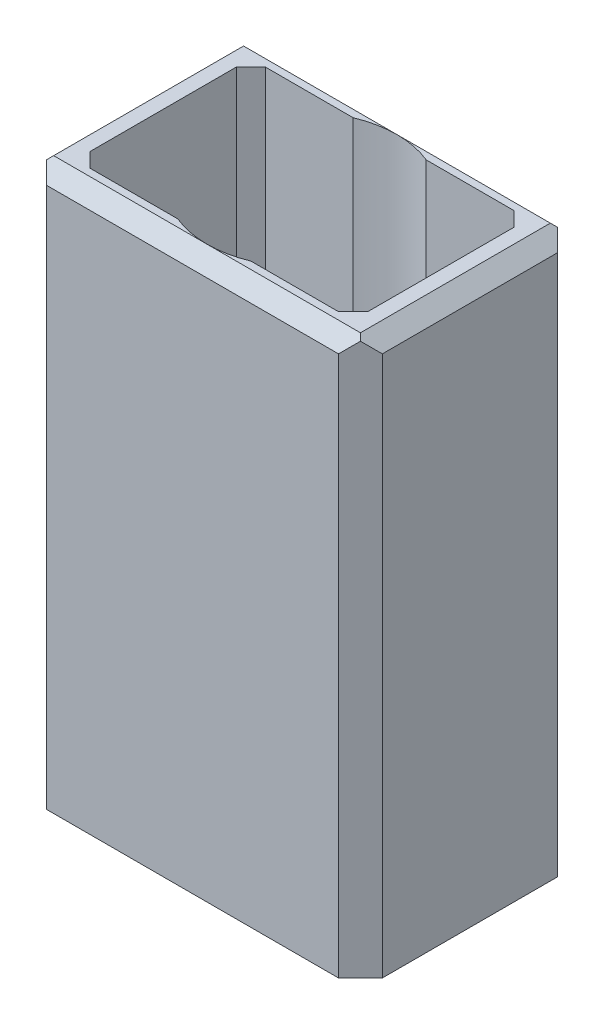
ISO-10303-21;
HEADER;
FILE_DESCRIPTION(('STEP AP214'),'2;1');
FILE_NAME('part.step','',(''),(''),'','','');
FILE_SCHEMA(('AUTOMOTIVE_DESIGN { 1 0 10303 214 1 1 1 1 }'));
ENDSEC;
DATA;
#1=APPLICATION_CONTEXT('core data for automotive mechanical design processes');
#2=APPLICATION_PROTOCOL_DEFINITION('international standard','automotive_design',2000,#1);
#3=PRODUCT_CONTEXT('',#1,'mechanical');
#4=PRODUCT('Part','Part','',(#3));
#5=PRODUCT_RELATED_PRODUCT_CATEGORY('part','',(#4));
#6=PRODUCT_DEFINITION_FORMATION('','',#4);
#7=PRODUCT_DEFINITION_CONTEXT('part definition',#1,'design');
#8=PRODUCT_DEFINITION('design','',#6,#7);
#9=PRODUCT_DEFINITION_SHAPE('','',#8);
#10=(LENGTH_UNIT() NAMED_UNIT(*) SI_UNIT(.MILLI.,.METRE.));
#11=(NAMED_UNIT(*) PLANE_ANGLE_UNIT() SI_UNIT($,.RADIAN.));
#12=(NAMED_UNIT(*) SI_UNIT($,.STERADIAN.) SOLID_ANGLE_UNIT());
#13=UNCERTAINTY_MEASURE_WITH_UNIT(LENGTH_MEASURE(1.E-05),#10,'distance_accuracy_value','');
#14=(GEOMETRIC_REPRESENTATION_CONTEXT(3) GLOBAL_UNCERTAINTY_ASSIGNED_CONTEXT((#13)) GLOBAL_UNIT_ASSIGNED_CONTEXT((#10,
#11,#12)) REPRESENTATION_CONTEXT('',''));
#15=CARTESIAN_POINT('',(0.,0.,0.));
#16=DIRECTION('',(0.,0.,1.));
#17=DIRECTION('',(1.,0.,0.));
#18=AXIS2_PLACEMENT_3D('',#15,#16,#17);
#19=CARTESIAN_POINT('',(0.,35.,0.));
#20=DIRECTION('',(0.,-1.,0.));
#21=DIRECTION('',(0.,0.,-1.));
#22=AXIS2_PLACEMENT_3D('',#19,#20,#21);
#23=PLANE('',#22);
#24=CARTESIAN_POINT('',(0.,35.,0.));
#25=DIRECTION('',(0.,-1.,0.));
#26=DIRECTION('',(0.,0.,-1.));
#27=AXIS2_PLACEMENT_3D('',#24,#25,#26);
#28=CIRCLE('',#27,6.5);
#29=CARTESIAN_POINT('',(-2.5,35.,6.));
#30=VERTEX_POINT('',#29);
#31=CARTESIAN_POINT('',(0.,35.,6.5));
#32=VERTEX_POINT('',#31);
#33=EDGE_CURVE('E425',#30,#32,#28,.F.);
#34=ORIENTED_EDGE('',*,*,#33,.F.);
#35=DIRECTION('',(1.,0.,0.));
#36=VECTOR('',#35,1.);
#37=CARTESIAN_POINT('',(-9.5,35.,6.));
#38=LINE('',#37,#36);
#39=CARTESIAN_POINT('',(-8.5,35.,6.));
#40=VERTEX_POINT('',#39);
#41=EDGE_CURVE('E394',#40,#30,#38,.T.);
#42=ORIENTED_EDGE('',*,*,#41,.F.);
#43=DIRECTION('',(0.707106781186543,0.,0.707106781186552));
#44=VECTOR('',#43,1.);
#45=CARTESIAN_POINT('',(-7.25000000000006,35.,7.24999999999996));
#46=LINE('',#45,#44);
#47=CARTESIAN_POINT('',(-9.5,35.,4.99999999999999));
#48=VERTEX_POINT('',#47);
#49=EDGE_CURVE('E295',#40,#48,#46,.F.);
#50=ORIENTED_EDGE('',*,*,#49,.T.);
#51=DIRECTION('',(0.,0.,1.));
#52=VECTOR('',#51,1.);
#53=CARTESIAN_POINT('',(-9.5,35.,6.));
#54=LINE('',#53,#52);
#55=CARTESIAN_POINT('',(-9.5,35.,-5.));
#56=VERTEX_POINT('',#55);
#57=EDGE_CURVE('E391',#56,#48,#54,.T.);
#58=ORIENTED_EDGE('',*,*,#57,.F.);
#59=DIRECTION('',(-0.707106781186552,0.,0.707106781186543));
#60=VECTOR('',#59,1.);
#61=CARTESIAN_POINT('',(-7.24999999999993,35.,-7.25000000000003));
#62=LINE('',#61,#60);
#63=CARTESIAN_POINT('',(-8.49999999999998,35.,-6.));
#64=VERTEX_POINT('',#63);
#65=EDGE_CURVE('E306',#56,#64,#62,.F.);
#66=ORIENTED_EDGE('',*,*,#65,.T.);
#67=DIRECTION('',(-1.,0.,0.));
#68=VECTOR('',#67,1.);
#69=CARTESIAN_POINT('',(-9.5,35.,-6.));
#70=LINE('',#69,#68);
#71=CARTESIAN_POINT('',(-2.5,35.,-6.));
#72=VERTEX_POINT('',#71);
#73=EDGE_CURVE('E389',#72,#64,#70,.T.);
#74=ORIENTED_EDGE('',*,*,#73,.F.);
#75=CARTESIAN_POINT('',(0.,35.,-6.5));
#76=VERTEX_POINT('',#75);
#77=EDGE_CURVE('E422',#76,#72,#28,.F.);
#78=ORIENTED_EDGE('',*,*,#77,.F.);
#79=DIRECTION('',(-1.,0.,0.));
#80=VECTOR('',#79,1.);
#81=CARTESIAN_POINT('',(0.,35.,-6.5));
#82=LINE('',#81,#80);
#83=CARTESIAN_POINT('',(-10.5,35.,-6.5));
#84=VERTEX_POINT('',#83);
#85=EDGE_CURVE('E241',#76,#84,#82,.T.);
#86=ORIENTED_EDGE('',*,*,#85,.T.);
#87=DIRECTION('',(0.,0.,1.));
#88=VECTOR('',#87,1.);
#89=CARTESIAN_POINT('',(-10.5,35.,0.));
#90=LINE('',#89,#88);
#91=CARTESIAN_POINT('',(-10.5,35.,6.5));
#92=VERTEX_POINT('',#91);
#93=EDGE_CURVE('E245',#84,#92,#90,.T.);
#94=ORIENTED_EDGE('',*,*,#93,.T.);
#95=DIRECTION('',(1.,0.,0.));
#96=VECTOR('',#95,1.);
#97=CARTESIAN_POINT('',(0.,35.,6.5));
#98=LINE('',#97,#96);
#99=EDGE_CURVE('E235',#92,#32,#98,.T.);
#100=ORIENTED_EDGE('',*,*,#99,.T.);
#101=EDGE_LOOP('',(#34,#42,#50,#58,#66,#74,#78,#86,#94,#100));
#102=FACE_BOUND('',#101,.T.);
#103=ADVANCED_FACE('F35',(#102),#23,.F.);
#104=CARTESIAN_POINT('',(-9.5,35.,-6.));
#105=DIRECTION('',(0.,0.,1.));
#106=DIRECTION('',(1.,0.,0.));
#107=AXIS2_PLACEMENT_3D('',#104,#105,#106);
#108=PLANE('',#107);
#109=DIRECTION('',(-1.,0.,0.));
#110=VECTOR('',#109,1.);
#111=CARTESIAN_POINT('',(-9.5,0.,-6.));
#112=LINE('',#111,#110);
#113=CARTESIAN_POINT('',(-2.5,0.,-6.));
#114=VERTEX_POINT('',#113);
#115=CARTESIAN_POINT('',(-8.49999999999998,0.,-6.));
#116=VERTEX_POINT('',#115);
#117=EDGE_CURVE('E223',#114,#116,#112,.T.);
#118=ORIENTED_EDGE('',*,*,#117,.F.);
#119=DIRECTION('',(0.,-1.,0.));
#120=VECTOR('',#119,1.);
#121=CARTESIAN_POINT('',(-2.5,40.,-6.));
#122=LINE('',#121,#120);
#123=EDGE_CURVE('E203',#114,#72,#122,.F.);
#124=ORIENTED_EDGE('',*,*,#123,.T.);
#125=ORIENTED_EDGE('',*,*,#73,.T.);
#126=DIRECTION('',(0.,-1.,0.));
#127=VECTOR('',#126,1.);
#128=CARTESIAN_POINT('',(-8.49999999999998,0.,-6.));
#129=LINE('',#128,#127);
#130=EDGE_CURVE('E289',#64,#116,#129,.T.);
#131=ORIENTED_EDGE('',*,*,#130,.T.);
#132=EDGE_LOOP('',(#118,#124,#125,#131));
#133=FACE_BOUND('',#132,.T.);
#134=ADVANCED_FACE('F448',(#133),#108,.T.);
#135=CARTESIAN_POINT('',(8.50000000000001,35.,-6.));
#136=VERTEX_POINT('',#135);
#137=CARTESIAN_POINT('',(2.5,35.,-6.));
#138=VERTEX_POINT('',#137);
#139=EDGE_CURVE('E214',#136,#138,#70,.T.);
#140=ORIENTED_EDGE('',*,*,#139,.T.);
#141=DIRECTION('',(0.,-1.,0.));
#142=VECTOR('',#141,1.);
#143=CARTESIAN_POINT('',(2.5,40.,-6.));
#144=LINE('',#143,#142);
#145=CARTESIAN_POINT('',(2.5,0.,-6.));
#146=VERTEX_POINT('',#145);
#147=EDGE_CURVE('E200',#138,#146,#144,.T.);
#148=ORIENTED_EDGE('',*,*,#147,.T.);
#149=CARTESIAN_POINT('',(8.50000000000001,0.,-6.));
#150=VERTEX_POINT('',#149);
#151=EDGE_CURVE('E211',#150,#146,#112,.T.);
#152=ORIENTED_EDGE('',*,*,#151,.F.);
#153=DIRECTION('',(0.,1.,0.));
#154=VECTOR('',#153,1.);
#155=CARTESIAN_POINT('',(8.50000000000001,35.,-6.));
#156=LINE('',#155,#154);
#157=EDGE_CURVE('E287',#150,#136,#156,.T.);
#158=ORIENTED_EDGE('',*,*,#157,.T.);
#159=EDGE_LOOP('',(#140,#148,#152,#158));
#160=FACE_BOUND('',#159,.T.);
#161=ADVANCED_FACE('F210',(#160),#108,.T.);
#162=CARTESIAN_POINT('',(-9.5,35.,6.));
#163=DIRECTION('',(0.,0.,-1.));
#164=DIRECTION('',(-1.,0.,0.));
#165=AXIS2_PLACEMENT_3D('',#162,#163,#164);
#166=PLANE('',#165);
#167=DIRECTION('',(1.,0.,0.));
#168=VECTOR('',#167,1.);
#169=CARTESIAN_POINT('',(-9.5,0.,6.));
#170=LINE('',#169,#168);
#171=CARTESIAN_POINT('',(2.5,0.,6.));
#172=VERTEX_POINT('',#171);
#173=CARTESIAN_POINT('',(8.49999999999999,0.,6.));
#174=VERTEX_POINT('',#173);
#175=EDGE_CURVE('E226',#172,#174,#170,.T.);
#176=ORIENTED_EDGE('',*,*,#175,.F.);
#177=DIRECTION('',(0.,-1.,0.));
#178=VECTOR('',#177,1.);
#179=CARTESIAN_POINT('',(2.5,40.,6.));
#180=LINE('',#179,#178);
#181=CARTESIAN_POINT('',(2.5,35.,6.));
#182=VERTEX_POINT('',#181);
#183=EDGE_CURVE('E216',#172,#182,#180,.F.);
#184=ORIENTED_EDGE('',*,*,#183,.T.);
#185=CARTESIAN_POINT('',(8.49999999999999,35.,6.));
#186=VERTEX_POINT('',#185);
#187=EDGE_CURVE('E393',#182,#186,#38,.T.);
#188=ORIENTED_EDGE('',*,*,#187,.T.);
#189=DIRECTION('',(0.,-1.,0.));
#190=VECTOR('',#189,1.);
#191=CARTESIAN_POINT('',(8.49999999999999,0.,6.));
#192=LINE('',#191,#190);
#193=EDGE_CURVE('E277',#186,#174,#192,.T.);
#194=ORIENTED_EDGE('',*,*,#193,.T.);
#195=EDGE_LOOP('',(#176,#184,#188,#194));
#196=FACE_BOUND('',#195,.T.);
#197=ADVANCED_FACE('F403',(#196),#166,.T.);
#198=ORIENTED_EDGE('',*,*,#41,.T.);
#199=DIRECTION('',(0.,-1.,0.));
#200=VECTOR('',#199,1.);
#201=CARTESIAN_POINT('',(-2.5,40.,6.));
#202=LINE('',#201,#200);
#203=CARTESIAN_POINT('',(-2.5,0.,6.));
#204=VERTEX_POINT('',#203);
#205=EDGE_CURVE('E205',#30,#204,#202,.T.);
#206=ORIENTED_EDGE('',*,*,#205,.T.);
#207=CARTESIAN_POINT('',(-8.5,0.,6.));
#208=VERTEX_POINT('',#207);
#209=EDGE_CURVE('E232',#208,#204,#170,.T.);
#210=ORIENTED_EDGE('',*,*,#209,.F.);
#211=DIRECTION('',(0.,1.,0.));
#212=VECTOR('',#211,1.);
#213=CARTESIAN_POINT('',(-8.5,35.,6.));
#214=LINE('',#213,#212);
#215=EDGE_CURVE('E280',#208,#40,#214,.T.);
#216=ORIENTED_EDGE('',*,*,#215,.T.);
#217=EDGE_LOOP('',(#198,#206,#210,#216));
#218=FACE_BOUND('',#217,.T.);
#219=ADVANCED_FACE('F430',(#218),#166,.T.);
#220=EDGE_CURVE('E424',#32,#182,#28,.F.);
#221=ORIENTED_EDGE('',*,*,#220,.F.);
#222=CARTESIAN_POINT('',(10.5,35.,6.5));
#223=VERTEX_POINT('',#222);
#224=EDGE_CURVE('E239',#32,#223,#98,.T.);
#225=ORIENTED_EDGE('',*,*,#224,.T.);
#226=DIRECTION('',(0.,0.,-1.));
#227=VECTOR('',#226,1.);
#228=CARTESIAN_POINT('',(10.5,35.,0.));
#229=LINE('',#228,#227);
#230=CARTESIAN_POINT('',(10.5,35.,-6.5));
#231=VERTEX_POINT('',#230);
#232=EDGE_CURVE('E238',#223,#231,#229,.T.);
#233=ORIENTED_EDGE('',*,*,#232,.T.);
#234=EDGE_CURVE('E242',#231,#76,#82,.T.);
#235=ORIENTED_EDGE('',*,*,#234,.T.);
#236=EDGE_CURVE('E215',#138,#76,#28,.F.);
#237=ORIENTED_EDGE('',*,*,#236,.F.);
#238=ORIENTED_EDGE('',*,*,#139,.F.);
#239=DIRECTION('',(-0.707106781186543,0.,-0.707106781186552));
#240=VECTOR('',#239,1.);
#241=CARTESIAN_POINT('',(7.25000000000006,35.,-7.24999999999996));
#242=LINE('',#241,#240);
#243=CARTESIAN_POINT('',(9.5,35.,-4.99999999999999));
#244=VERTEX_POINT('',#243);
#245=EDGE_CURVE('E310',#136,#244,#242,.F.);
#246=ORIENTED_EDGE('',*,*,#245,.T.);
#247=DIRECTION('',(0.,0.,-1.));
#248=VECTOR('',#247,1.);
#249=CARTESIAN_POINT('',(9.5,35.,6.));
#250=LINE('',#249,#248);
#251=CARTESIAN_POINT('',(9.5,35.,5.00000000000001));
#252=VERTEX_POINT('',#251);
#253=EDGE_CURVE('E234',#252,#244,#250,.T.);
#254=ORIENTED_EDGE('',*,*,#253,.F.);
#255=DIRECTION('',(0.707106781186552,0.,-0.707106781186543));
#256=VECTOR('',#255,1.);
#257=CARTESIAN_POINT('',(7.24999999999994,35.,7.25000000000004));
#258=LINE('',#257,#256);
#259=EDGE_CURVE('E300',#252,#186,#258,.F.);
#260=ORIENTED_EDGE('',*,*,#259,.T.);
#261=ORIENTED_EDGE('',*,*,#187,.F.);
#262=EDGE_LOOP('',(#221,#225,#233,#235,#237,#238,#246,#254,#260,#261));
#263=FACE_BOUND('',#262,.T.);
#264=ADVANCED_FACE('F409',(#263),#23,.F.);
#265=CARTESIAN_POINT('',(11.5,35.,7.5));
#266=DIRECTION('',(-1.,0.,0.));
#267=DIRECTION('',(0.,0.,1.));
#268=AXIS2_PLACEMENT_3D('',#265,#266,#267);
#269=PLANE('',#268);
#270=DIRECTION('',(0.,0.,1.));
#271=VECTOR('',#270,1.);
#272=CARTESIAN_POINT('',(11.5,34.,7.5));
#273=LINE('',#272,#271);
#274=CARTESIAN_POINT('',(11.5,34.,-5.99999999999999));
#275=VERTEX_POINT('',#274);
#276=CARTESIAN_POINT('',(11.5,34.,5.99999999999999));
#277=VERTEX_POINT('',#276);
#278=EDGE_CURVE('E254',#275,#277,#273,.T.);
#279=ORIENTED_EDGE('',*,*,#278,.T.);
#280=DIRECTION('',(0.,-1.,0.));
#281=VECTOR('',#280,1.);
#282=CARTESIAN_POINT('',(11.5,35.,5.99999999999999));
#283=LINE('',#282,#281);
#284=CARTESIAN_POINT('',(11.5,-3.,5.99999999999999));
#285=VERTEX_POINT('',#284);
#286=EDGE_CURVE('E314',#277,#285,#283,.T.);
#287=ORIENTED_EDGE('',*,*,#286,.T.);
#288=DIRECTION('',(0.,0.,1.));
#289=VECTOR('',#288,1.);
#290=CARTESIAN_POINT('',(11.5,-3.,-7.5));
#291=LINE('',#290,#289);
#292=CARTESIAN_POINT('',(11.5,-3.,-5.99999999999999));
#293=VERTEX_POINT('',#292);
#294=EDGE_CURVE('E378',#293,#285,#291,.T.);
#295=ORIENTED_EDGE('',*,*,#294,.F.);
#296=DIRECTION('',(0.,1.,0.));
#297=VECTOR('',#296,1.);
#298=CARTESIAN_POINT('',(11.5,35.,-5.99999999999999));
#299=LINE('',#298,#297);
#300=EDGE_CURVE('E312',#293,#275,#299,.T.);
#301=ORIENTED_EDGE('',*,*,#300,.T.);
#302=EDGE_LOOP('',(#279,#287,#295,#301));
#303=FACE_BOUND('',#302,.T.);
#304=ADVANCED_FACE('F472',(#303),#269,.F.);
#305=CARTESIAN_POINT('',(-11.5,35.,-7.5));
#306=DIRECTION('',(0.,0.,1.));
#307=DIRECTION('',(1.,0.,0.));
#308=AXIS2_PLACEMENT_3D('',#305,#306,#307);
#309=PLANE('',#308);
#310=DIRECTION('',(1.,0.,0.));
#311=VECTOR('',#310,1.);
#312=CARTESIAN_POINT('',(-11.5,34.,-7.5));
#313=LINE('',#312,#311);
#314=CARTESIAN_POINT('',(-9.99999999999999,34.,-7.5));
#315=VERTEX_POINT('',#314);
#316=CARTESIAN_POINT('',(9.99999999999999,34.,-7.5));
#317=VERTEX_POINT('',#316);
#318=EDGE_CURVE('E251',#315,#317,#313,.T.);
#319=ORIENTED_EDGE('',*,*,#318,.T.);
#320=DIRECTION('',(0.,-1.,0.));
#321=VECTOR('',#320,1.);
#322=CARTESIAN_POINT('',(9.99999999999999,35.,-7.5));
#323=LINE('',#322,#321);
#324=CARTESIAN_POINT('',(9.99999999999999,-3.,-7.5));
#325=VERTEX_POINT('',#324);
#326=EDGE_CURVE('E340',#317,#325,#323,.T.);
#327=ORIENTED_EDGE('',*,*,#326,.T.);
#328=DIRECTION('',(1.,0.,0.));
#329=VECTOR('',#328,1.);
#330=CARTESIAN_POINT('',(11.5,-3.,-7.5));
#331=LINE('',#330,#329);
#332=CARTESIAN_POINT('',(-9.99999999999999,-3.,-7.5));
#333=VERTEX_POINT('',#332);
#334=EDGE_CURVE('E372',#333,#325,#331,.T.);
#335=ORIENTED_EDGE('',*,*,#334,.F.);
#336=DIRECTION('',(0.,1.,0.));
#337=VECTOR('',#336,1.);
#338=CARTESIAN_POINT('',(-9.99999999999999,35.,-7.5));
#339=LINE('',#338,#337);
#340=EDGE_CURVE('E338',#333,#315,#339,.T.);
#341=ORIENTED_EDGE('',*,*,#340,.T.);
#342=EDGE_LOOP('',(#319,#327,#335,#341));
#343=FACE_BOUND('',#342,.T.);
#344=ADVANCED_FACE('F375',(#343),#309,.F.);
#345=CARTESIAN_POINT('',(-11.5,35.,7.5));
#346=DIRECTION('',(1.,0.,0.));
#347=DIRECTION('',(0.,0.,-1.));
#348=AXIS2_PLACEMENT_3D('',#345,#346,#347);
#349=PLANE('',#348);
#350=DIRECTION('',(0.,0.,-1.));
#351=VECTOR('',#350,1.);
#352=CARTESIAN_POINT('',(-11.5,-3.,-7.5));
#353=LINE('',#352,#351);
#354=CARTESIAN_POINT('',(-11.5,-3.,5.99999999999999));
#355=VERTEX_POINT('',#354);
#356=CARTESIAN_POINT('',(-11.5,-3.,-5.99999999999999));
#357=VERTEX_POINT('',#356);
#358=EDGE_CURVE('E373',#355,#357,#353,.T.);
#359=ORIENTED_EDGE('',*,*,#358,.F.);
#360=DIRECTION('',(0.,1.,0.));
#361=VECTOR('',#360,1.);
#362=CARTESIAN_POINT('',(-11.5,35.,5.99999999999999));
#363=LINE('',#362,#361);
#364=CARTESIAN_POINT('',(-11.5,34.,5.99999999999999));
#365=VERTEX_POINT('',#364);
#366=EDGE_CURVE('E350',#355,#365,#363,.T.);
#367=ORIENTED_EDGE('',*,*,#366,.T.);
#368=DIRECTION('',(0.,0.,-1.));
#369=VECTOR('',#368,1.);
#370=CARTESIAN_POINT('',(-11.5,34.,7.5));
#371=LINE('',#370,#369);
#372=CARTESIAN_POINT('',(-11.5,34.,-5.99999999999999));
#373=VERTEX_POINT('',#372);
#374=EDGE_CURVE('E248',#365,#373,#371,.T.);
#375=ORIENTED_EDGE('',*,*,#374,.T.);
#376=DIRECTION('',(0.,-1.,0.));
#377=VECTOR('',#376,1.);
#378=CARTESIAN_POINT('',(-11.5,35.,-5.99999999999999));
#379=LINE('',#378,#377);
#380=EDGE_CURVE('E347',#373,#357,#379,.T.);
#381=ORIENTED_EDGE('',*,*,#380,.T.);
#382=EDGE_LOOP('',(#359,#367,#375,#381));
#383=FACE_BOUND('',#382,.T.);
#384=ADVANCED_FACE('F363',(#383),#349,.F.);
#385=CARTESIAN_POINT('',(-11.5,35.,7.5));
#386=DIRECTION('',(0.,0.,-1.));
#387=DIRECTION('',(-1.,0.,0.));
#388=AXIS2_PLACEMENT_3D('',#385,#386,#387);
#389=PLANE('',#388);
#390=DIRECTION('',(-1.,0.,0.));
#391=VECTOR('',#390,1.);
#392=CARTESIAN_POINT('',(11.5,-3.,7.5));
#393=LINE('',#392,#391);
#394=CARTESIAN_POINT('',(9.99999999999999,-3.,7.5));
#395=VERTEX_POINT('',#394);
#396=CARTESIAN_POINT('',(-9.99999999999999,-3.,7.5));
#397=VERTEX_POINT('',#396);
#398=EDGE_CURVE('E264',#395,#397,#393,.T.);
#399=ORIENTED_EDGE('',*,*,#398,.F.);
#400=DIRECTION('',(0.,1.,0.));
#401=VECTOR('',#400,1.);
#402=CARTESIAN_POINT('',(9.99999999999999,35.,7.5));
#403=LINE('',#402,#401);
#404=CARTESIAN_POINT('',(9.99999999999999,34.,7.5));
#405=VERTEX_POINT('',#404);
#406=EDGE_CURVE('E328',#395,#405,#403,.T.);
#407=ORIENTED_EDGE('',*,*,#406,.T.);
#408=DIRECTION('',(-1.,0.,0.));
#409=VECTOR('',#408,1.);
#410=CARTESIAN_POINT('',(-11.5,34.,7.5));
#411=LINE('',#410,#409);
#412=CARTESIAN_POINT('',(-9.99999999999999,34.,7.5));
#413=VERTEX_POINT('',#412);
#414=EDGE_CURVE('E257',#405,#413,#411,.T.);
#415=ORIENTED_EDGE('',*,*,#414,.T.);
#416=DIRECTION('',(0.,-1.,0.));
#417=VECTOR('',#416,1.);
#418=CARTESIAN_POINT('',(-9.99999999999999,35.,7.5));
#419=LINE('',#418,#417);
#420=EDGE_CURVE('E325',#413,#397,#419,.T.);
#421=ORIENTED_EDGE('',*,*,#420,.T.);
#422=EDGE_LOOP('',(#399,#407,#415,#421));
#423=FACE_BOUND('',#422,.T.);
#424=ADVANCED_FACE('F481',(#423),#389,.F.);
#425=CARTESIAN_POINT('',(9.5,35.,6.));
#426=DIRECTION('',(-1.,0.,0.));
#427=DIRECTION('',(0.,0.,1.));
#428=AXIS2_PLACEMENT_3D('',#425,#426,#427);
#429=PLANE('',#428);
#430=DIRECTION('',(0.,0.,-1.));
#431=VECTOR('',#430,1.);
#432=CARTESIAN_POINT('',(9.5,0.,6.));
#433=LINE('',#432,#431);
#434=CARTESIAN_POINT('',(9.5,0.,5.00000000000001));
#435=VERTEX_POINT('',#434);
#436=CARTESIAN_POINT('',(9.5,0.,-4.99999999999999));
#437=VERTEX_POINT('',#436);
#438=EDGE_CURVE('E228',#435,#437,#433,.T.);
#439=ORIENTED_EDGE('',*,*,#438,.F.);
#440=DIRECTION('',(0.,1.,0.));
#441=VECTOR('',#440,1.);
#442=CARTESIAN_POINT('',(9.5,35.,5.00000000000001));
#443=LINE('',#442,#441);
#444=EDGE_CURVE('E285',#435,#252,#443,.T.);
#445=ORIENTED_EDGE('',*,*,#444,.T.);
#446=ORIENTED_EDGE('',*,*,#253,.T.);
#447=DIRECTION('',(0.,-1.,0.));
#448=VECTOR('',#447,1.);
#449=CARTESIAN_POINT('',(9.5,0.,-4.99999999999999));
#450=LINE('',#449,#448);
#451=EDGE_CURVE('E282',#244,#437,#450,.T.);
#452=ORIENTED_EDGE('',*,*,#451,.T.);
#453=EDGE_LOOP('',(#439,#445,#446,#452));
#454=FACE_BOUND('',#453,.T.);
#455=ADVANCED_FACE('F415',(#454),#429,.T.);
#456=CARTESIAN_POINT('',(-9.5,35.,6.));
#457=DIRECTION('',(1.,0.,0.));
#458=DIRECTION('',(0.,0.,-1.));
#459=AXIS2_PLACEMENT_3D('',#456,#457,#458);
#460=PLANE('',#459);
#461=ORIENTED_EDGE('',*,*,#57,.T.);
#462=DIRECTION('',(0.,-1.,0.));
#463=VECTOR('',#462,1.);
#464=CARTESIAN_POINT('',(-9.5,0.,4.99999999999999));
#465=LINE('',#464,#463);
#466=CARTESIAN_POINT('',(-9.5,0.,4.99999999999999));
#467=VERTEX_POINT('',#466);
#468=EDGE_CURVE('E274',#48,#467,#465,.T.);
#469=ORIENTED_EDGE('',*,*,#468,.T.);
#470=DIRECTION('',(0.,0.,1.));
#471=VECTOR('',#470,1.);
#472=CARTESIAN_POINT('',(-9.5,0.,6.));
#473=LINE('',#472,#471);
#474=CARTESIAN_POINT('',(-9.5,0.,-5.));
#475=VERTEX_POINT('',#474);
#476=EDGE_CURVE('E222',#475,#467,#473,.T.);
#477=ORIENTED_EDGE('',*,*,#476,.F.);
#478=DIRECTION('',(0.,1.,0.));
#479=VECTOR('',#478,1.);
#480=CARTESIAN_POINT('',(-9.5,35.,-5.));
#481=LINE('',#480,#479);
#482=EDGE_CURVE('E260',#475,#56,#481,.T.);
#483=ORIENTED_EDGE('',*,*,#482,.T.);
#484=EDGE_LOOP('',(#461,#469,#477,#483));
#485=FACE_BOUND('',#484,.T.);
#486=ADVANCED_FACE('F437',(#485),#460,.T.);
#487=CARTESIAN_POINT('',(10.5,35.,0.));
#488=DIRECTION('',(-0.707106781186547,-0.707106781186547,0.));
#489=DIRECTION('',(0.,0.,-1.));
#490=AXIS2_PLACEMENT_3D('',#487,#488,#489);
#491=PLANE('',#490);
#492=DIRECTION('',(-0.577350269189626,0.577350269189626,-0.577350269189626));
#493=VECTOR('',#492,1.);
#494=CARTESIAN_POINT('',(7.,38.5,3.));
#495=LINE('',#494,#493);
#496=CARTESIAN_POINT('',(10.75,34.75,6.75));
#497=VERTEX_POINT('',#496);
#498=EDGE_CURVE('E267',#497,#223,#495,.T.);
#499=ORIENTED_EDGE('',*,*,#498,.F.);
#500=DIRECTION('',(0.577350269189626,-0.577350269189626,-0.577350269189626));
#501=VECTOR('',#500,1.);
#502=CARTESIAN_POINT('',(12.8333333333333,32.6666666666667,4.66666666666666));
#503=LINE('',#502,#501);
#504=EDGE_CURVE('E336',#497,#277,#503,.T.);
#505=ORIENTED_EDGE('',*,*,#504,.T.);
#506=ORIENTED_EDGE('',*,*,#278,.F.);
#507=DIRECTION('',(-0.577350269189626,0.577350269189626,-0.577350269189626));
#508=VECTOR('',#507,1.);
#509=CARTESIAN_POINT('',(12.8333333333333,32.6666666666667,-4.66666666666666));
#510=LINE('',#509,#508);
#511=CARTESIAN_POINT('',(10.75,34.75,-6.75));
#512=VERTEX_POINT('',#511);
#513=EDGE_CURVE('E334',#275,#512,#510,.T.);
#514=ORIENTED_EDGE('',*,*,#513,.T.);
#515=DIRECTION('',(-0.577350269189626,0.577350269189626,0.577350269189626));
#516=VECTOR('',#515,1.);
#517=CARTESIAN_POINT('',(8.33333333333333,37.1666666666667,-4.33333333333333));
#518=LINE('',#517,#516);
#519=EDGE_CURVE('E270',#231,#512,#518,.F.);
#520=ORIENTED_EDGE('',*,*,#519,.F.);
#521=ORIENTED_EDGE('',*,*,#232,.F.);
#522=EDGE_LOOP('',(#499,#505,#506,#514,#520,#521));
#523=FACE_BOUND('',#522,.T.);
#524=ADVANCED_FACE('F463',(#523),#491,.F.);
#525=CARTESIAN_POINT('',(0.,35.,-6.5));
#526=DIRECTION('',(0.,-0.707106781186547,0.707106781186547));
#527=DIRECTION('',(-1.,0.,0.));
#528=AXIS2_PLACEMENT_3D('',#525,#526,#527);
#529=PLANE('',#528);
#530=ORIENTED_EDGE('',*,*,#519,.T.);
#531=DIRECTION('',(-0.577350269189625,-0.577350269189626,-0.577350269189626));
#532=VECTOR('',#531,1.);
#533=CARTESIAN_POINT('',(7.33333333333333,31.3333333333333,-10.1666666666667));
#534=LINE('',#533,#532);
#535=EDGE_CURVE('E345',#512,#317,#534,.T.);
#536=ORIENTED_EDGE('',*,*,#535,.T.);
#537=ORIENTED_EDGE('',*,*,#318,.F.);
#538=DIRECTION('',(-0.577350269189626,0.577350269189626,0.577350269189626));
#539=VECTOR('',#538,1.);
#540=CARTESIAN_POINT('',(-7.33333333333333,31.3333333333333,-10.1666666666667));
#541=LINE('',#540,#539);
#542=CARTESIAN_POINT('',(-10.75,34.75,-6.74999999999999));
#543=VERTEX_POINT('',#542);
#544=EDGE_CURVE('E343',#315,#543,#541,.T.);
#545=ORIENTED_EDGE('',*,*,#544,.T.);
#546=DIRECTION('',(0.577350269189626,0.577350269189626,0.577350269189626));
#547=VECTOR('',#546,1.);
#548=CARTESIAN_POINT('',(-7.,38.5,-3.));
#549=LINE('',#548,#547);
#550=EDGE_CURVE('E263',#84,#543,#549,.F.);
#551=ORIENTED_EDGE('',*,*,#550,.F.);
#552=ORIENTED_EDGE('',*,*,#85,.F.);
#553=ORIENTED_EDGE('',*,*,#234,.F.);
#554=EDGE_LOOP('',(#530,#536,#537,#545,#551,#552,#553));
#555=FACE_BOUND('',#554,.T.);
#556=ADVANCED_FACE('F451',(#555),#529,.F.);
#557=CARTESIAN_POINT('',(0.,35.,6.5));
#558=DIRECTION('',(0.,-0.707106781186547,-0.707106781186547));
#559=DIRECTION('',(1.,0.,0.));
#560=AXIS2_PLACEMENT_3D('',#557,#558,#559);
#561=PLANE('',#560);
#562=ORIENTED_EDGE('',*,*,#414,.F.);
#563=DIRECTION('',(0.577350269189625,0.577350269189626,-0.577350269189626));
#564=VECTOR('',#563,1.);
#565=CARTESIAN_POINT('',(7.33333333333333,31.3333333333333,10.1666666666667));
#566=LINE('',#565,#564);
#567=EDGE_CURVE('E332',#405,#497,#566,.T.);
#568=ORIENTED_EDGE('',*,*,#567,.T.);
#569=ORIENTED_EDGE('',*,*,#498,.T.);
#570=ORIENTED_EDGE('',*,*,#224,.F.);
#571=ORIENTED_EDGE('',*,*,#99,.F.);
#572=DIRECTION('',(-0.577350269189626,-0.577350269189626,0.577350269189626));
#573=VECTOR('',#572,1.);
#574=CARTESIAN_POINT('',(-7.,38.5,3.));
#575=LINE('',#574,#573);
#576=CARTESIAN_POINT('',(-10.75,34.75,6.74999999999999));
#577=VERTEX_POINT('',#576);
#578=EDGE_CURVE('E261',#577,#92,#575,.F.);
#579=ORIENTED_EDGE('',*,*,#578,.F.);
#580=DIRECTION('',(0.577350269189626,-0.577350269189626,0.577350269189626));
#581=VECTOR('',#580,1.);
#582=CARTESIAN_POINT('',(-7.33333333333333,31.3333333333333,10.1666666666667));
#583=LINE('',#582,#581);
#584=EDGE_CURVE('E330',#577,#413,#583,.T.);
#585=ORIENTED_EDGE('',*,*,#584,.T.);
#586=EDGE_LOOP('',(#562,#568,#569,#570,#571,#579,#585));
#587=FACE_BOUND('',#586,.T.);
#588=ADVANCED_FACE('F457',(#587),#561,.F.);
#589=CARTESIAN_POINT('',(-10.5,35.,0.));
#590=DIRECTION('',(0.707106781186547,-0.707106781186547,0.));
#591=DIRECTION('',(0.,0.,1.));
#592=AXIS2_PLACEMENT_3D('',#589,#590,#591);
#593=PLANE('',#592);
#594=ORIENTED_EDGE('',*,*,#374,.F.);
#595=DIRECTION('',(0.577350269189626,0.577350269189626,0.577350269189626));
#596=VECTOR('',#595,1.);
#597=CARTESIAN_POINT('',(-12.8333333333333,32.6666666666667,4.66666666666666));
#598=LINE('',#597,#596);
#599=EDGE_CURVE('E11',#365,#577,#598,.T.);
#600=ORIENTED_EDGE('',*,*,#599,.T.);
#601=ORIENTED_EDGE('',*,*,#578,.T.);
#602=ORIENTED_EDGE('',*,*,#93,.F.);
#603=ORIENTED_EDGE('',*,*,#550,.T.);
#604=DIRECTION('',(-0.577350269189626,-0.577350269189626,0.577350269189626));
#605=VECTOR('',#604,1.);
#606=CARTESIAN_POINT('',(-12.8333333333333,32.6666666666667,-4.66666666666666));
#607=LINE('',#606,#605);
#608=EDGE_CURVE('E43',#543,#373,#607,.T.);
#609=ORIENTED_EDGE('',*,*,#608,.T.);
#610=EDGE_LOOP('',(#594,#600,#601,#602,#603,#609));
#611=FACE_BOUND('',#610,.T.);
#612=ADVANCED_FACE('F354',(#611),#593,.F.);
#613=CARTESIAN_POINT('',(-9.5,35.,4.99999999999999));
#614=DIRECTION('',(0.707106781186552,0.,-0.707106781186543));
#615=DIRECTION('',(0.,1.,0.));
#616=AXIS2_PLACEMENT_3D('',#613,#614,#615);
#617=PLANE('',#616);
#618=ORIENTED_EDGE('',*,*,#49,.F.);
#619=ORIENTED_EDGE('',*,*,#215,.F.);
#620=DIRECTION('',(-0.707106781186543,0.,-0.707106781186552));
#621=VECTOR('',#620,1.);
#622=CARTESIAN_POINT('',(-9.5,0.,4.99999999999999));
#623=LINE('',#622,#621);
#624=EDGE_CURVE('E292',#467,#208,#623,.F.);
#625=ORIENTED_EDGE('',*,*,#624,.F.);
#626=ORIENTED_EDGE('',*,*,#468,.F.);
#627=EDGE_LOOP('',(#618,#619,#625,#626));
#628=FACE_BOUND('',#627,.T.);
#629=ADVANCED_FACE('F435',(#628),#617,.T.);
#630=CARTESIAN_POINT('',(8.49999999999999,35.,6.));
#631=DIRECTION('',(-0.707106781186543,0.,-0.707106781186552));
#632=DIRECTION('',(0.,1.,0.));
#633=AXIS2_PLACEMENT_3D('',#630,#631,#632);
#634=PLANE('',#633);
#635=ORIENTED_EDGE('',*,*,#259,.F.);
#636=ORIENTED_EDGE('',*,*,#444,.F.);
#637=DIRECTION('',(-0.707106781186552,0.,0.707106781186543));
#638=VECTOR('',#637,1.);
#639=CARTESIAN_POINT('',(8.49999999999999,0.,6.));
#640=LINE('',#639,#638);
#641=EDGE_CURVE('E297',#174,#435,#640,.F.);
#642=ORIENTED_EDGE('',*,*,#641,.F.);
#643=ORIENTED_EDGE('',*,*,#193,.F.);
#644=EDGE_LOOP('',(#635,#636,#642,#643));
#645=FACE_BOUND('',#644,.T.);
#646=ADVANCED_FACE('F413',(#645),#634,.T.);
#647=CARTESIAN_POINT('',(-8.49999999999998,35.,-6.));
#648=DIRECTION('',(0.707106781186542,0.,0.707106781186552));
#649=DIRECTION('',(0.,1.,0.));
#650=AXIS2_PLACEMENT_3D('',#647,#648,#649);
#651=PLANE('',#650);
#652=ORIENTED_EDGE('',*,*,#65,.F.);
#653=ORIENTED_EDGE('',*,*,#482,.F.);
#654=DIRECTION('',(0.707106781186552,0.,-0.707106781186543));
#655=VECTOR('',#654,1.);
#656=CARTESIAN_POINT('',(-8.49999999999998,0.,-6.));
#657=LINE('',#656,#655);
#658=EDGE_CURVE('E303',#116,#475,#657,.F.);
#659=ORIENTED_EDGE('',*,*,#658,.F.);
#660=ORIENTED_EDGE('',*,*,#130,.F.);
#661=EDGE_LOOP('',(#652,#653,#659,#660));
#662=FACE_BOUND('',#661,.T.);
#663=ADVANCED_FACE('F445',(#662),#651,.T.);
#664=CARTESIAN_POINT('',(9.5,35.,-4.99999999999999));
#665=DIRECTION('',(-0.707106781186552,0.,0.707106781186543));
#666=DIRECTION('',(0.,1.,0.));
#667=AXIS2_PLACEMENT_3D('',#664,#665,#666);
#668=PLANE('',#667);
#669=ORIENTED_EDGE('',*,*,#245,.F.);
#670=ORIENTED_EDGE('',*,*,#157,.F.);
#671=DIRECTION('',(0.707106781186543,0.,0.707106781186552));
#672=VECTOR('',#671,1.);
#673=CARTESIAN_POINT('',(9.5,0.,-4.99999999999999));
#674=LINE('',#673,#672);
#675=EDGE_CURVE('E221',#437,#150,#674,.F.);
#676=ORIENTED_EDGE('',*,*,#675,.F.);
#677=ORIENTED_EDGE('',*,*,#451,.F.);
#678=EDGE_LOOP('',(#669,#670,#676,#677));
#679=FACE_BOUND('',#678,.T.);
#680=ADVANCED_FACE('F419',(#679),#668,.T.);
#681=CARTESIAN_POINT('',(0.,0.,0.));
#682=DIRECTION('',(0.,-1.,0.));
#683=DIRECTION('',(0.,0.,-1.));
#684=AXIS2_PLACEMENT_3D('',#681,#682,#683);
#685=PLANE('',#684);
#686=ORIENTED_EDGE('',*,*,#151,.T.);
#687=CARTESIAN_POINT('',(0.,0.,0.));
#688=DIRECTION('',(0.,1.,0.));
#689=DIRECTION('',(0.,0.,1.));
#690=AXIS2_PLACEMENT_3D('',#687,#688,#689);
#691=CIRCLE('',#690,6.5);
#692=EDGE_CURVE('E50',#146,#114,#691,.T.);
#693=ORIENTED_EDGE('',*,*,#692,.T.);
#694=ORIENTED_EDGE('',*,*,#117,.T.);
#695=ORIENTED_EDGE('',*,*,#658,.T.);
#696=ORIENTED_EDGE('',*,*,#476,.T.);
#697=ORIENTED_EDGE('',*,*,#624,.T.);
#698=ORIENTED_EDGE('',*,*,#209,.T.);
#699=EDGE_CURVE('E57',#204,#172,#691,.T.);
#700=ORIENTED_EDGE('',*,*,#699,.T.);
#701=ORIENTED_EDGE('',*,*,#175,.T.);
#702=ORIENTED_EDGE('',*,*,#641,.T.);
#703=ORIENTED_EDGE('',*,*,#438,.T.);
#704=ORIENTED_EDGE('',*,*,#675,.T.);
#705=EDGE_LOOP('',(#686,#693,#694,#695,#696,#697,#698,#700,#701,#702,#703,#704));
#706=FACE_BOUND('',#705,.T.);
#707=CARTESIAN_POINT('',(0.,0.,0.));
#708=DIRECTION('',(0.,-1.,0.));
#709=DIRECTION('',(0.,0.,-1.));
#710=AXIS2_PLACEMENT_3D('',#707,#708,#709);
#711=CIRCLE('',#710,2.5);
#712=CARTESIAN_POINT('',(0.,0.,-2.5));
#713=VERTEX_POINT('',#712);
#714=EDGE_CURVE('E381',#713,#713,#711,.T.);
#715=ORIENTED_EDGE('',*,*,#714,.T.);
#716=EDGE_LOOP('',(#715));
#717=FACE_BOUND('',#716,.T.);
#718=ADVANCED_FACE('F218',(#706,#717),#685,.F.);
#719=CARTESIAN_POINT('',(0.,-3.,0.));
#720=DIRECTION('',(0.,-1.,0.));
#721=DIRECTION('',(0.,0.,-1.));
#722=AXIS2_PLACEMENT_3D('',#719,#720,#721);
#723=PLANE('',#722);
#724=CARTESIAN_POINT('',(0.,-3.,0.));
#725=DIRECTION('',(0.,-1.,0.));
#726=DIRECTION('',(0.,0.,-1.));
#727=AXIS2_PLACEMENT_3D('',#724,#725,#726);
#728=CIRCLE('',#727,2.5);
#729=CARTESIAN_POINT('',(0.,-3.,-2.5));
#730=VERTEX_POINT('',#729);
#731=EDGE_CURVE('E735',#730,#730,#728,.T.);
#732=ORIENTED_EDGE('',*,*,#731,.F.);
#733=EDGE_LOOP('',(#732));
#734=FACE_BOUND('',#733,.T.);
#735=ORIENTED_EDGE('',*,*,#294,.T.);
#736=DIRECTION('',(0.707106781186547,0.,-0.707106781186548));
#737=VECTOR('',#736,1.);
#738=CARTESIAN_POINT('',(8.75,-3.,8.74999999999999));
#739=LINE('',#738,#737);
#740=EDGE_CURVE('E323',#285,#395,#739,.F.);
#741=ORIENTED_EDGE('',*,*,#740,.T.);
#742=ORIENTED_EDGE('',*,*,#398,.T.);
#743=DIRECTION('',(0.707106781186548,0.,0.707106781186548));
#744=VECTOR('',#743,1.);
#745=CARTESIAN_POINT('',(-8.75,-3.,8.75));
#746=LINE('',#745,#744);
#747=EDGE_CURVE('E319',#397,#355,#746,.F.);
#748=ORIENTED_EDGE('',*,*,#747,.T.);
#749=ORIENTED_EDGE('',*,*,#358,.T.);
#750=DIRECTION('',(-0.707106781186548,0.,0.707106781186548));
#751=VECTOR('',#750,1.);
#752=CARTESIAN_POINT('',(-8.75,-3.,-8.75));
#753=LINE('',#752,#751);
#754=EDGE_CURVE('E317',#357,#333,#753,.F.);
#755=ORIENTED_EDGE('',*,*,#754,.T.);
#756=ORIENTED_EDGE('',*,*,#334,.T.);
#757=DIRECTION('',(-0.707106781186547,0.,-0.707106781186548));
#758=VECTOR('',#757,1.);
#759=CARTESIAN_POINT('',(8.75,-3.,-8.74999999999999));
#760=LINE('',#759,#758);
#761=EDGE_CURVE('E321',#325,#293,#760,.F.);
#762=ORIENTED_EDGE('',*,*,#761,.T.);
#763=EDGE_LOOP('',(#735,#741,#742,#748,#749,#755,#756,#762));
#764=FACE_BOUND('',#763,.T.);
#765=ADVANCED_FACE('F371',(#734,#764),#723,.T.);
#766=CARTESIAN_POINT('',(11.5,35.,5.99999999999999));
#767=DIRECTION('',(-0.707106781186548,0.,-0.707106781186547));
#768=DIRECTION('',(0.,-1.,0.));
#769=AXIS2_PLACEMENT_3D('',#766,#767,#768);
#770=PLANE('',#769);
#771=ORIENTED_EDGE('',*,*,#567,.F.);
#772=ORIENTED_EDGE('',*,*,#406,.F.);
#773=ORIENTED_EDGE('',*,*,#740,.F.);
#774=ORIENTED_EDGE('',*,*,#286,.F.);
#775=ORIENTED_EDGE('',*,*,#504,.F.);
#776=EDGE_LOOP('',(#771,#772,#773,#774,#775));
#777=FACE_BOUND('',#776,.T.);
#778=ADVANCED_FACE('F477',(#777),#770,.F.);
#779=CARTESIAN_POINT('',(9.99999999999999,35.,-7.5));
#780=DIRECTION('',(-0.707106781186548,0.,0.707106781186547));
#781=DIRECTION('',(0.,-1.,0.));
#782=AXIS2_PLACEMENT_3D('',#779,#780,#781);
#783=PLANE('',#782);
#784=ORIENTED_EDGE('',*,*,#513,.F.);
#785=ORIENTED_EDGE('',*,*,#300,.F.);
#786=ORIENTED_EDGE('',*,*,#761,.F.);
#787=ORIENTED_EDGE('',*,*,#326,.F.);
#788=ORIENTED_EDGE('',*,*,#535,.F.);
#789=EDGE_LOOP('',(#784,#785,#786,#787,#788));
#790=FACE_BOUND('',#789,.T.);
#791=ADVANCED_FACE('F468',(#790),#783,.F.);
#792=CARTESIAN_POINT('',(-9.99999999999999,35.,7.5));
#793=DIRECTION('',(0.707106781186548,0.,-0.707106781186548));
#794=DIRECTION('',(0.,-1.,0.));
#795=AXIS2_PLACEMENT_3D('',#792,#793,#794);
#796=PLANE('',#795);
#797=ORIENTED_EDGE('',*,*,#599,.F.);
#798=ORIENTED_EDGE('',*,*,#366,.F.);
#799=ORIENTED_EDGE('',*,*,#747,.F.);
#800=ORIENTED_EDGE('',*,*,#420,.F.);
#801=ORIENTED_EDGE('',*,*,#584,.F.);
#802=EDGE_LOOP('',(#797,#798,#799,#800,#801));
#803=FACE_BOUND('',#802,.T.);
#804=ADVANCED_FACE('F484',(#803),#796,.F.);
#805=CARTESIAN_POINT('',(-11.5,35.,-5.99999999999999));
#806=DIRECTION('',(0.707106781186548,0.,0.707106781186548));
#807=DIRECTION('',(0.,-1.,0.));
#808=AXIS2_PLACEMENT_3D('',#805,#806,#807);
#809=PLANE('',#808);
#810=ORIENTED_EDGE('',*,*,#544,.F.);
#811=ORIENTED_EDGE('',*,*,#340,.F.);
#812=ORIENTED_EDGE('',*,*,#754,.F.);
#813=ORIENTED_EDGE('',*,*,#380,.F.);
#814=ORIENTED_EDGE('',*,*,#608,.F.);
#815=EDGE_LOOP('',(#810,#811,#812,#813,#814));
#816=FACE_BOUND('',#815,.T.);
#817=ADVANCED_FACE('F37',(#816),#809,.F.);
#818=CARTESIAN_POINT('',(0.,0.,0.));
#819=DIRECTION('',(0.,-1.,0.));
#820=DIRECTION('',(0.,0.,-1.));
#821=AXIS2_PLACEMENT_3D('',#818,#819,#820);
#822=CYLINDRICAL_SURFACE('',#821,2.5);
#823=ORIENTED_EDGE('',*,*,#714,.F.);
#824=EDGE_LOOP('',(#823));
#825=FACE_BOUND('',#824,.T.);
#826=ORIENTED_EDGE('',*,*,#731,.T.);
#827=EDGE_LOOP('',(#826));
#828=FACE_BOUND('',#827,.T.);
#829=ADVANCED_FACE('F490',(#825,#828),#822,.F.);
#830=CARTESIAN_POINT('',(0.,40.,0.));
#831=DIRECTION('',(0.,-1.,0.));
#832=DIRECTION('',(0.,0.,-1.));
#833=AXIS2_PLACEMENT_3D('',#830,#831,#832);
#834=CYLINDRICAL_SURFACE('',#833,6.5);
#835=ORIENTED_EDGE('',*,*,#699,.F.);
#836=ORIENTED_EDGE('',*,*,#205,.F.);
#837=ORIENTED_EDGE('',*,*,#33,.T.);
#838=ORIENTED_EDGE('',*,*,#220,.T.);
#839=ORIENTED_EDGE('',*,*,#183,.F.);
#840=EDGE_LOOP('',(#835,#836,#837,#838,#839));
#841=FACE_BOUND('',#840,.T.);
#842=ADVANCED_FACE('F553',(#841),#834,.F.);
#843=ORIENTED_EDGE('',*,*,#692,.F.);
#844=ORIENTED_EDGE('',*,*,#147,.F.);
#845=ORIENTED_EDGE('',*,*,#236,.T.);
#846=ORIENTED_EDGE('',*,*,#77,.T.);
#847=ORIENTED_EDGE('',*,*,#123,.F.);
#848=EDGE_LOOP('',(#843,#844,#845,#846,#847));
#849=FACE_BOUND('',#848,.T.);
#850=ADVANCED_FACE('F199',(#849),#834,.F.);
#851=CLOSED_SHELL('',(#103,#134,#161,#197,#219,#264,#304,#344,#384,#424,#455,#486,#524,#556,
#588,#612,#629,#646,#663,#680,#718,#765,#778,#791,#804,#817,#829,#842,#850));
#852=MANIFOLD_SOLID_BREP('B2',#851);
#853=ADVANCED_BREP_SHAPE_REPRESENTATION('',(#18,#852),#14);
#854=SHAPE_DEFINITION_REPRESENTATION(#9,#853);
ENDSEC;
END-ISO-10303-21;
